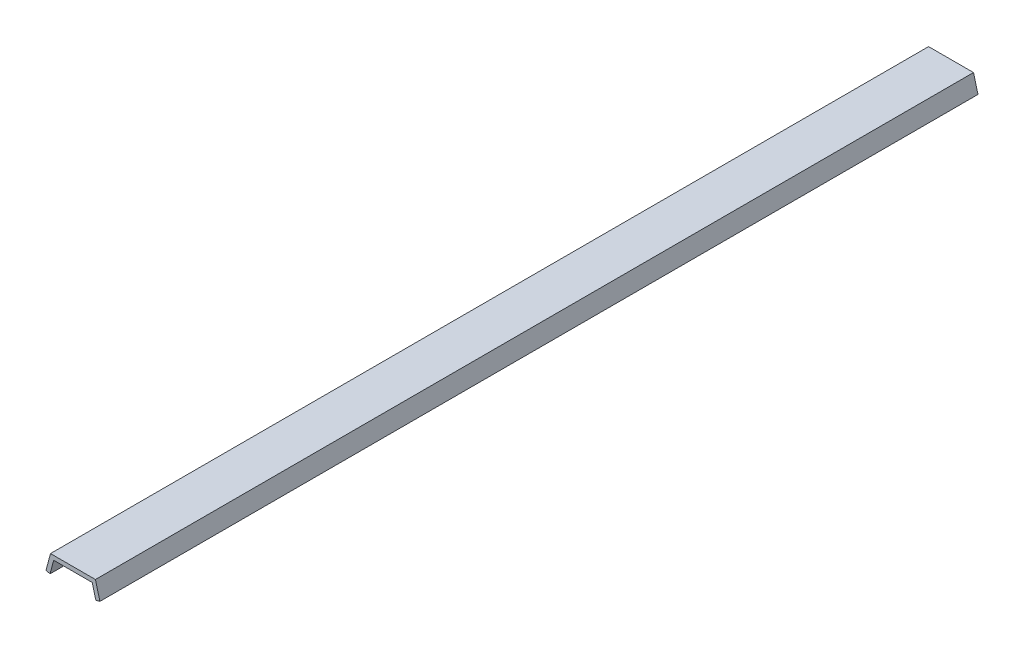
ISO-10303-21;
HEADER;
FILE_DESCRIPTION(('STEP AP214'),'2;1');
FILE_NAME('part.step','',(''),(''),'','','');
FILE_SCHEMA(('AUTOMOTIVE_DESIGN { 1 0 10303 214 1 1 1 1 }'));
ENDSEC;
DATA;
#1=APPLICATION_CONTEXT('core data for automotive mechanical design processes');
#2=APPLICATION_PROTOCOL_DEFINITION('international standard','automotive_design',2000,#1);
#3=PRODUCT_CONTEXT('',#1,'mechanical');
#4=PRODUCT('Part','Part','',(#3));
#5=PRODUCT_RELATED_PRODUCT_CATEGORY('part','',(#4));
#6=PRODUCT_DEFINITION_FORMATION('','',#4);
#7=PRODUCT_DEFINITION_CONTEXT('part definition',#1,'design');
#8=PRODUCT_DEFINITION('design','',#6,#7);
#9=PRODUCT_DEFINITION_SHAPE('','',#8);
#10=(LENGTH_UNIT() NAMED_UNIT(*) SI_UNIT(.MILLI.,.METRE.));
#11=(NAMED_UNIT(*) PLANE_ANGLE_UNIT() SI_UNIT($,.RADIAN.));
#12=(NAMED_UNIT(*) SI_UNIT($,.STERADIAN.) SOLID_ANGLE_UNIT());
#13=UNCERTAINTY_MEASURE_WITH_UNIT(LENGTH_MEASURE(1.E-05),#10,'distance_accuracy_value','');
#14=(GEOMETRIC_REPRESENTATION_CONTEXT(3) GLOBAL_UNCERTAINTY_ASSIGNED_CONTEXT((#13)) GLOBAL_UNIT_ASSIGNED_CONTEXT((#10,
#11,#12)) REPRESENTATION_CONTEXT('',''));
#15=CARTESIAN_POINT('',(0.,0.,0.));
#16=DIRECTION('',(0.,0.,1.));
#17=DIRECTION('',(1.,0.,0.));
#18=AXIS2_PLACEMENT_3D('',#15,#16,#17);
#19=CARTESIAN_POINT('',(4.40907417371093,3.74118095489748,105.));
#20=DIRECTION('',(0.965925826289069,0.258819045102518,0.));
#21=DIRECTION('',(-0.258819045102518,0.965925826289069,0.));
#22=AXIS2_PLACEMENT_3D('',#19,#20,#21);
#23=PLANE('',#22);
#24=DIRECTION('',(0.258819045102518,-0.965925826289069,0.));
#25=VECTOR('',#24,1.);
#26=CARTESIAN_POINT('',(4.40907417371093,3.74118095489748,-105.));
#27=LINE('',#26,#25);
#28=CARTESIAN_POINT('',(4.60767301202104,3.,-105.));
#29=VERTEX_POINT('',#28);
#30=CARTESIAN_POINT('',(5.48087094343541,-0.258819045102519,-105.));
#31=VERTEX_POINT('',#30);
#32=EDGE_CURVE('E131',#29,#31,#27,.T.);
#33=ORIENTED_EDGE('',*,*,#32,.T.);
#34=DIRECTION('',(0.,0.,-1.));
#35=VECTOR('',#34,1.);
#36=CARTESIAN_POINT('',(5.48087094343541,-0.258819045102519,105.));
#37=LINE('',#36,#35);
#38=CARTESIAN_POINT('',(5.48087094343541,-0.258819045102519,105.));
#39=VERTEX_POINT('',#38);
#40=EDGE_CURVE('E11',#39,#31,#37,.T.);
#41=ORIENTED_EDGE('',*,*,#40,.F.);
#42=DIRECTION('',(0.258819045102518,-0.965925826289069,0.));
#43=VECTOR('',#42,1.);
#44=CARTESIAN_POINT('',(4.40907417371093,3.74118095489748,105.));
#45=LINE('',#44,#43);
#46=CARTESIAN_POINT('',(4.60767301202104,3.,105.));
#47=VERTEX_POINT('',#46);
#48=EDGE_CURVE('E89',#47,#39,#45,.T.);
#49=ORIENTED_EDGE('',*,*,#48,.F.);
#50=DIRECTION('',(0.,0.,-1.));
#51=VECTOR('',#50,1.);
#52=CARTESIAN_POINT('',(4.60767301202104,3.,105.));
#53=LINE('',#52,#51);
#54=EDGE_CURVE('E130',#47,#29,#53,.T.);
#55=ORIENTED_EDGE('',*,*,#54,.T.);
#56=EDGE_LOOP('',(#33,#41,#49,#55));
#57=FACE_BOUND('',#56,.T.);
#58=ADVANCED_FACE('F34',(#57),#23,.F.);
#59=CARTESIAN_POINT('',(6.44679676972448,0.,105.));
#60=DIRECTION('',(0.258819045102519,-0.965925826289069,0.));
#61=DIRECTION('',(0.965925826289069,0.258819045102519,0.));
#62=AXIS2_PLACEMENT_3D('',#59,#60,#61);
#63=PLANE('',#62);
#64=DIRECTION('',(-0.965925826289069,-0.258819045102519,0.));
#65=VECTOR('',#64,1.);
#66=CARTESIAN_POINT('',(6.44679676972448,0.,-105.));
#67=LINE('',#66,#65);
#68=CARTESIAN_POINT('',(6.44679676972448,0.,-105.));
#69=VERTEX_POINT('',#68);
#70=EDGE_CURVE('E134',#69,#31,#67,.T.);
#71=ORIENTED_EDGE('',*,*,#70,.F.);
#72=DIRECTION('',(0.,0.,-1.));
#73=VECTOR('',#72,1.);
#74=CARTESIAN_POINT('',(6.44679676972448,0.,105.));
#75=LINE('',#74,#73);
#76=CARTESIAN_POINT('',(6.44679676972448,0.,105.));
#77=VERTEX_POINT('',#76);
#78=EDGE_CURVE('E42',#77,#69,#75,.T.);
#79=ORIENTED_EDGE('',*,*,#78,.F.);
#80=DIRECTION('',(-0.965925826289069,-0.258819045102519,0.));
#81=VECTOR('',#80,1.);
#82=CARTESIAN_POINT('',(6.44679676972448,0.,105.));
#83=LINE('',#82,#81);
#84=EDGE_CURVE('E173',#77,#39,#83,.T.);
#85=ORIENTED_EDGE('',*,*,#84,.T.);
#86=ORIENTED_EDGE('',*,*,#40,.T.);
#87=EDGE_LOOP('',(#71,#79,#85,#86));
#88=FACE_BOUND('',#87,.T.);
#89=ADVANCED_FACE('F164',(#88),#63,.T.);
#90=CARTESIAN_POINT('',(5.375,4.,105.));
#91=DIRECTION('',(0.965925826289069,0.258819045102518,0.));
#92=DIRECTION('',(-0.258819045102518,0.965925826289069,0.));
#93=AXIS2_PLACEMENT_3D('',#90,#91,#92);
#94=PLANE('',#93);
#95=DIRECTION('',(0.258819045102518,-0.965925826289069,0.));
#96=VECTOR('',#95,1.);
#97=CARTESIAN_POINT('',(5.375,4.,-105.));
#98=LINE('',#97,#96);
#99=CARTESIAN_POINT('',(5.375,4.,-105.));
#100=VERTEX_POINT('',#99);
#101=EDGE_CURVE('E137',#100,#69,#98,.T.);
#102=ORIENTED_EDGE('',*,*,#101,.F.);
#103=DIRECTION('',(0.,0.,-1.));
#104=VECTOR('',#103,1.);
#105=CARTESIAN_POINT('',(5.375,4.,105.));
#106=LINE('',#105,#104);
#107=CARTESIAN_POINT('',(5.375,4.,105.));
#108=VERTEX_POINT('',#107);
#109=EDGE_CURVE('E154',#108,#100,#106,.T.);
#110=ORIENTED_EDGE('',*,*,#109,.F.);
#111=DIRECTION('',(0.258819045102518,-0.965925826289069,0.));
#112=VECTOR('',#111,1.);
#113=CARTESIAN_POINT('',(5.375,4.,105.));
#114=LINE('',#113,#112);
#115=EDGE_CURVE('E161',#108,#77,#114,.T.);
#116=ORIENTED_EDGE('',*,*,#115,.T.);
#117=ORIENTED_EDGE('',*,*,#78,.T.);
#118=EDGE_LOOP('',(#102,#110,#116,#117));
#119=FACE_BOUND('',#118,.T.);
#120=ADVANCED_FACE('F159',(#119),#94,.T.);
#121=CARTESIAN_POINT('',(5.375,4.,105.));
#122=DIRECTION('',(0.,1.,0.));
#123=DIRECTION('',(0.,0.,1.));
#124=AXIS2_PLACEMENT_3D('',#121,#122,#123);
#125=PLANE('',#124);
#126=DIRECTION('',(1.,0.,0.));
#127=VECTOR('',#126,1.);
#128=CARTESIAN_POINT('',(5.375,4.,-105.));
#129=LINE('',#128,#127);
#130=CARTESIAN_POINT('',(-5.375,4.,-105.));
#131=VERTEX_POINT('',#130);
#132=EDGE_CURVE('E140',#131,#100,#129,.T.);
#133=ORIENTED_EDGE('',*,*,#132,.F.);
#134=DIRECTION('',(0.,0.,-1.));
#135=VECTOR('',#134,1.);
#136=CARTESIAN_POINT('',(-5.375,4.,105.));
#137=LINE('',#136,#135);
#138=CARTESIAN_POINT('',(-5.375,4.,105.));
#139=VERTEX_POINT('',#138);
#140=EDGE_CURVE('E152',#139,#131,#137,.T.);
#141=ORIENTED_EDGE('',*,*,#140,.F.);
#142=DIRECTION('',(1.,0.,0.));
#143=VECTOR('',#142,1.);
#144=CARTESIAN_POINT('',(5.375,4.,105.));
#145=LINE('',#144,#143);
#146=EDGE_CURVE('E125',#139,#108,#145,.T.);
#147=ORIENTED_EDGE('',*,*,#146,.T.);
#148=ORIENTED_EDGE('',*,*,#109,.T.);
#149=EDGE_LOOP('',(#133,#141,#147,#148));
#150=FACE_BOUND('',#149,.T.);
#151=ADVANCED_FACE('F171',(#150),#125,.T.);
#152=CARTESIAN_POINT('',(-5.375,4.,105.));
#153=DIRECTION('',(-0.965925826289069,0.258819045102518,0.));
#154=DIRECTION('',(-0.258819045102518,-0.965925826289069,0.));
#155=AXIS2_PLACEMENT_3D('',#152,#153,#154);
#156=PLANE('',#155);
#157=DIRECTION('',(0.258819045102518,0.965925826289069,0.));
#158=VECTOR('',#157,1.);
#159=CARTESIAN_POINT('',(-5.375,4.,-105.));
#160=LINE('',#159,#158);
#161=CARTESIAN_POINT('',(-6.44679676972448,0.,-105.));
#162=VERTEX_POINT('',#161);
#163=EDGE_CURVE('E143',#162,#131,#160,.T.);
#164=ORIENTED_EDGE('',*,*,#163,.F.);
#165=DIRECTION('',(0.,0.,-1.));
#166=VECTOR('',#165,1.);
#167=CARTESIAN_POINT('',(-6.44679676972448,0.,105.));
#168=LINE('',#167,#166);
#169=CARTESIAN_POINT('',(-6.44679676972448,0.,105.));
#170=VERTEX_POINT('',#169);
#171=EDGE_CURVE('E113',#170,#162,#168,.T.);
#172=ORIENTED_EDGE('',*,*,#171,.F.);
#173=DIRECTION('',(0.258819045102518,0.965925826289069,0.));
#174=VECTOR('',#173,1.);
#175=CARTESIAN_POINT('',(-5.375,4.,105.));
#176=LINE('',#175,#174);
#177=EDGE_CURVE('E123',#170,#139,#176,.T.);
#178=ORIENTED_EDGE('',*,*,#177,.T.);
#179=ORIENTED_EDGE('',*,*,#140,.T.);
#180=EDGE_LOOP('',(#164,#172,#178,#179));
#181=FACE_BOUND('',#180,.T.);
#182=ADVANCED_FACE('F178',(#181),#156,.T.);
#183=CARTESIAN_POINT('',(-5.48087094343541,-0.258819045102519,105.));
#184=DIRECTION('',(-0.258819045102519,-0.965925826289069,0.));
#185=DIRECTION('',(0.965925826289069,-0.258819045102519,0.));
#186=AXIS2_PLACEMENT_3D('',#183,#184,#185);
#187=PLANE('',#186);
#188=DIRECTION('',(-0.965925826289069,0.258819045102519,0.));
#189=VECTOR('',#188,1.);
#190=CARTESIAN_POINT('',(-5.48087094343541,-0.258819045102519,-105.));
#191=LINE('',#190,#189);
#192=CARTESIAN_POINT('',(-5.48087094343541,-0.258819045102519,-105.));
#193=VERTEX_POINT('',#192);
#194=EDGE_CURVE('E112',#193,#162,#191,.T.);
#195=ORIENTED_EDGE('',*,*,#194,.F.);
#196=DIRECTION('',(0.,0.,-1.));
#197=VECTOR('',#196,1.);
#198=CARTESIAN_POINT('',(-5.48087094343541,-0.258819045102519,105.));
#199=LINE('',#198,#197);
#200=CARTESIAN_POINT('',(-5.48087094343541,-0.258819045102519,105.));
#201=VERTEX_POINT('',#200);
#202=EDGE_CURVE('E106',#201,#193,#199,.T.);
#203=ORIENTED_EDGE('',*,*,#202,.F.);
#204=DIRECTION('',(-0.965925826289069,0.258819045102519,0.));
#205=VECTOR('',#204,1.);
#206=CARTESIAN_POINT('',(-5.48087094343541,-0.258819045102519,105.));
#207=LINE('',#206,#205);
#208=EDGE_CURVE('E110',#201,#170,#207,.T.);
#209=ORIENTED_EDGE('',*,*,#208,.T.);
#210=ORIENTED_EDGE('',*,*,#171,.T.);
#211=EDGE_LOOP('',(#195,#203,#209,#210));
#212=FACE_BOUND('',#211,.T.);
#213=ADVANCED_FACE('F108',(#212),#187,.T.);
#214=CARTESIAN_POINT('',(-4.40907417371093,3.74118095489748,105.));
#215=DIRECTION('',(-0.965925826289069,0.258819045102518,0.));
#216=DIRECTION('',(-0.258819045102518,-0.965925826289069,0.));
#217=AXIS2_PLACEMENT_3D('',#214,#215,#216);
#218=PLANE('',#217);
#219=DIRECTION('',(0.258819045102518,0.965925826289069,0.));
#220=VECTOR('',#219,1.);
#221=CARTESIAN_POINT('',(-4.40907417371093,3.74118095489748,-105.));
#222=LINE('',#221,#220);
#223=CARTESIAN_POINT('',(-4.60767301202104,3.,-105.));
#224=VERTEX_POINT('',#223);
#225=EDGE_CURVE('E77',#193,#224,#222,.T.);
#226=ORIENTED_EDGE('',*,*,#225,.T.);
#227=DIRECTION('',(0.,0.,-1.));
#228=VECTOR('',#227,1.);
#229=CARTESIAN_POINT('',(-4.60767301202104,3.,105.));
#230=LINE('',#229,#228);
#231=CARTESIAN_POINT('',(-4.60767301202104,3.,105.));
#232=VERTEX_POINT('',#231);
#233=EDGE_CURVE('E114',#232,#224,#230,.T.);
#234=ORIENTED_EDGE('',*,*,#233,.F.);
#235=DIRECTION('',(0.258819045102518,0.965925826289069,0.));
#236=VECTOR('',#235,1.);
#237=CARTESIAN_POINT('',(-4.40907417371093,3.74118095489748,105.));
#238=LINE('',#237,#236);
#239=EDGE_CURVE('E116',#201,#232,#238,.T.);
#240=ORIENTED_EDGE('',*,*,#239,.F.);
#241=ORIENTED_EDGE('',*,*,#202,.T.);
#242=EDGE_LOOP('',(#226,#234,#240,#241));
#243=FACE_BOUND('',#242,.T.);
#244=ADVANCED_FACE('F117',(#243),#218,.F.);
#245=CARTESIAN_POINT('',(5.375,3.,105.));
#246=DIRECTION('',(0.,1.,0.));
#247=DIRECTION('',(0.,0.,1.));
#248=AXIS2_PLACEMENT_3D('',#245,#246,#247);
#249=PLANE('',#248);
#250=DIRECTION('',(1.,0.,0.));
#251=VECTOR('',#250,1.);
#252=CARTESIAN_POINT('',(5.375,3.,-105.));
#253=LINE('',#252,#251);
#254=EDGE_CURVE('E83',#224,#29,#253,.T.);
#255=ORIENTED_EDGE('',*,*,#254,.T.);
#256=ORIENTED_EDGE('',*,*,#54,.F.);
#257=DIRECTION('',(1.,0.,0.));
#258=VECTOR('',#257,1.);
#259=CARTESIAN_POINT('',(5.375,3.,105.));
#260=LINE('',#259,#258);
#261=EDGE_CURVE('E50',#232,#47,#260,.T.);
#262=ORIENTED_EDGE('',*,*,#261,.F.);
#263=ORIENTED_EDGE('',*,*,#233,.T.);
#264=EDGE_LOOP('',(#255,#256,#262,#263));
#265=FACE_BOUND('',#264,.T.);
#266=ADVANCED_FACE('F180',(#265),#249,.F.);
#267=CARTESIAN_POINT('',(0.,0.,105.));
#268=DIRECTION('',(0.,0.,-1.));
#269=DIRECTION('',(-1.,0.,0.));
#270=AXIS2_PLACEMENT_3D('',#267,#268,#269);
#271=PLANE('',#270);
#272=ORIENTED_EDGE('',*,*,#48,.T.);
#273=ORIENTED_EDGE('',*,*,#84,.F.);
#274=ORIENTED_EDGE('',*,*,#115,.F.);
#275=ORIENTED_EDGE('',*,*,#146,.F.);
#276=ORIENTED_EDGE('',*,*,#177,.F.);
#277=ORIENTED_EDGE('',*,*,#208,.F.);
#278=ORIENTED_EDGE('',*,*,#239,.T.);
#279=ORIENTED_EDGE('',*,*,#261,.T.);
#280=EDGE_LOOP('',(#272,#273,#274,#275,#276,#277,#278,#279));
#281=FACE_BOUND('',#280,.T.);
#282=ADVANCED_FACE('F120',(#281),#271,.F.);
#283=CARTESIAN_POINT('',(0.,0.,-105.));
#284=DIRECTION('',(0.,0.,-1.));
#285=DIRECTION('',(-1.,0.,0.));
#286=AXIS2_PLACEMENT_3D('',#283,#284,#285);
#287=PLANE('',#286);
#288=ORIENTED_EDGE('',*,*,#32,.F.);
#289=ORIENTED_EDGE('',*,*,#254,.F.);
#290=ORIENTED_EDGE('',*,*,#225,.F.);
#291=ORIENTED_EDGE('',*,*,#194,.T.);
#292=ORIENTED_EDGE('',*,*,#163,.T.);
#293=ORIENTED_EDGE('',*,*,#132,.T.);
#294=ORIENTED_EDGE('',*,*,#101,.T.);
#295=ORIENTED_EDGE('',*,*,#70,.T.);
#296=EDGE_LOOP('',(#288,#289,#290,#291,#292,#293,#294,#295));
#297=FACE_BOUND('',#296,.T.);
#298=ADVANCED_FACE('F167',(#297),#287,.T.);
#299=CLOSED_SHELL('',(#58,#89,#120,#151,#182,#213,#244,#266,#282,#298));
#300=MANIFOLD_SOLID_BREP('B2',#299);
#301=ADVANCED_BREP_SHAPE_REPRESENTATION('',(#18,#300),#14);
#302=SHAPE_DEFINITION_REPRESENTATION(#9,#301);
ENDSEC;
END-ISO-10303-21;
